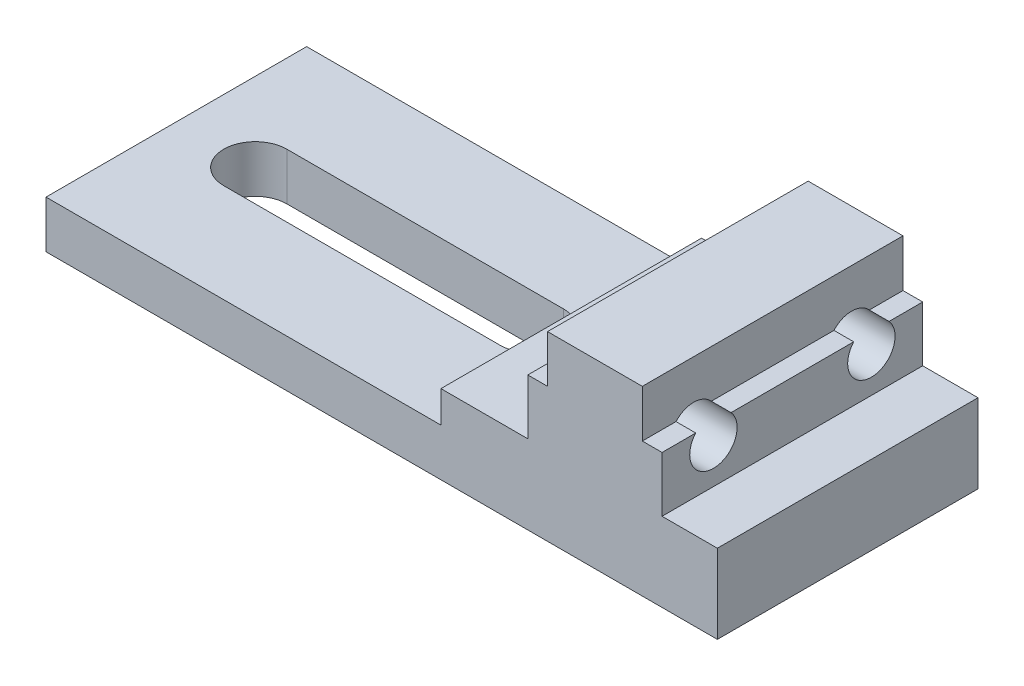
ISO-10303-21;
HEADER;
FILE_DESCRIPTION(('STEP AP214'),'2;1');
FILE_NAME('part.step','',(''),(''),'','','');
FILE_SCHEMA(('AUTOMOTIVE_DESIGN { 1 0 10303 214 1 1 1 1 }'));
ENDSEC;
DATA;
#1=APPLICATION_CONTEXT('core data for automotive mechanical design processes');
#2=APPLICATION_PROTOCOL_DEFINITION('international standard','automotive_design',2000,#1);
#3=PRODUCT_CONTEXT('',#1,'mechanical');
#4=PRODUCT('Part','Part','',(#3));
#5=PRODUCT_RELATED_PRODUCT_CATEGORY('part','',(#4));
#6=PRODUCT_DEFINITION_FORMATION('','',#4);
#7=PRODUCT_DEFINITION_CONTEXT('part definition',#1,'design');
#8=PRODUCT_DEFINITION('design','',#6,#7);
#9=PRODUCT_DEFINITION_SHAPE('','',#8);
#10=(LENGTH_UNIT() NAMED_UNIT(*) SI_UNIT(.MILLI.,.METRE.));
#11=(NAMED_UNIT(*) PLANE_ANGLE_UNIT() SI_UNIT($,.RADIAN.));
#12=(NAMED_UNIT(*) SI_UNIT($,.STERADIAN.) SOLID_ANGLE_UNIT());
#13=UNCERTAINTY_MEASURE_WITH_UNIT(LENGTH_MEASURE(1.E-05),#10,'distance_accuracy_value','');
#14=(GEOMETRIC_REPRESENTATION_CONTEXT(3) GLOBAL_UNCERTAINTY_ASSIGNED_CONTEXT((#13)) GLOBAL_UNIT_ASSIGNED_CONTEXT((#10,
#11,#12)) REPRESENTATION_CONTEXT('',''));
#15=CARTESIAN_POINT('',(0.,0.,0.));
#16=DIRECTION('',(0.,0.,1.));
#17=DIRECTION('',(1.,0.,0.));
#18=AXIS2_PLACEMENT_3D('',#15,#16,#17);
#19=CARTESIAN_POINT('',(78.,17.,16.5));
#20=DIRECTION('',(0.,-1.,0.));
#21=DIRECTION('',(0.,0.,-1.));
#22=AXIS2_PLACEMENT_3D('',#19,#20,#21);
#23=PLANE('',#22);
#24=DIRECTION('',(0.,0.,-1.));
#25=VECTOR('',#24,1.);
#26=CARTESIAN_POINT('',(75.5,17.,16.5));
#27=LINE('',#26,#25);
#28=CARTESIAN_POINT('',(75.5,17.,-12.2360679774997));
#29=VERTEX_POINT('',#28);
#30=CARTESIAN_POINT('',(75.5,17.,-16.5));
#31=VERTEX_POINT('',#30);
#32=EDGE_CURVE('E218',#29,#31,#27,.T.);
#33=ORIENTED_EDGE('',*,*,#32,.F.);
#34=DIRECTION('',(1.,0.,0.));
#35=VECTOR('',#34,1.);
#36=CARTESIAN_POINT('',(45.,17.,-12.2360679774997));
#37=LINE('',#36,#35);
#38=CARTESIAN_POINT('',(78.,17.,-12.2360679774997));
#39=VERTEX_POINT('',#38);
#40=EDGE_CURVE('E48',#29,#39,#37,.T.);
#41=ORIENTED_EDGE('',*,*,#40,.T.);
#42=DIRECTION('',(0.,0.,-1.));
#43=VECTOR('',#42,1.);
#44=CARTESIAN_POINT('',(78.,17.,16.5));
#45=LINE('',#44,#43);
#46=CARTESIAN_POINT('',(78.,17.,-16.5));
#47=VERTEX_POINT('',#46);
#48=EDGE_CURVE('E216',#39,#47,#45,.T.);
#49=ORIENTED_EDGE('',*,*,#48,.T.);
#50=DIRECTION('',(-1.,0.,0.));
#51=VECTOR('',#50,1.);
#52=CARTESIAN_POINT('',(78.,17.,-16.5));
#53=LINE('',#52,#51);
#54=EDGE_CURVE('E390',#47,#31,#53,.T.);
#55=ORIENTED_EDGE('',*,*,#54,.T.);
#56=EDGE_LOOP('',(#33,#41,#49,#55));
#57=FACE_BOUND('',#56,.T.);
#58=ADVANCED_FACE('F33',(#57),#23,.F.);
#59=CARTESIAN_POINT('',(63.5,17.,16.5));
#60=DIRECTION('',(0.,-1.,0.));
#61=DIRECTION('',(0.,0.,-1.));
#62=AXIS2_PLACEMENT_3D('',#59,#60,#61);
#63=PLANE('',#62);
#64=DIRECTION('',(0.,0.,-1.));
#65=VECTOR('',#64,1.);
#66=CARTESIAN_POINT('',(61.,17.,16.5));
#67=LINE('',#66,#65);
#68=CARTESIAN_POINT('',(61.,17.,-12.2360679774997));
#69=VERTEX_POINT('',#68);
#70=CARTESIAN_POINT('',(61.,17.,-16.5));
#71=VERTEX_POINT('',#70);
#72=EDGE_CURVE('E270',#69,#71,#67,.T.);
#73=ORIENTED_EDGE('',*,*,#72,.F.);
#74=DIRECTION('',(1.,0.,0.));
#75=VECTOR('',#74,1.);
#76=CARTESIAN_POINT('',(45.,17.,-12.2360679774997));
#77=LINE('',#76,#75);
#78=CARTESIAN_POINT('',(63.5,17.,-12.2360679774997));
#79=VERTEX_POINT('',#78);
#80=EDGE_CURVE('E56',#69,#79,#77,.T.);
#81=ORIENTED_EDGE('',*,*,#80,.T.);
#82=DIRECTION('',(0.,0.,-1.));
#83=VECTOR('',#82,1.);
#84=CARTESIAN_POINT('',(63.5,17.,16.5));
#85=LINE('',#84,#83);
#86=CARTESIAN_POINT('',(63.5,17.,-16.5));
#87=VERTEX_POINT('',#86);
#88=EDGE_CURVE('E272',#79,#87,#85,.T.);
#89=ORIENTED_EDGE('',*,*,#88,.T.);
#90=DIRECTION('',(-1.,0.,0.));
#91=VECTOR('',#90,1.);
#92=CARTESIAN_POINT('',(63.5,17.,-16.5));
#93=LINE('',#92,#91);
#94=EDGE_CURVE('E399',#87,#71,#93,.T.);
#95=ORIENTED_EDGE('',*,*,#94,.T.);
#96=EDGE_LOOP('',(#73,#81,#89,#95));
#97=FACE_BOUND('',#96,.T.);
#98=ADVANCED_FACE('F454',(#97),#63,.F.);
#99=CARTESIAN_POINT('',(78.,17.,7.76393202250029));
#100=VERTEX_POINT('',#99);
#101=CARTESIAN_POINT('',(78.,17.,-7.76393202250029));
#102=VERTEX_POINT('',#101);
#103=EDGE_CURVE('E226',#100,#102,#45,.T.);
#104=ORIENTED_EDGE('',*,*,#103,.T.);
#105=DIRECTION('',(1.,0.,0.));
#106=VECTOR('',#105,1.);
#107=CARTESIAN_POINT('',(45.,17.,-7.76393202250029));
#108=LINE('',#107,#106);
#109=CARTESIAN_POINT('',(75.5,17.,-7.76393202250029));
#110=VERTEX_POINT('',#109);
#111=EDGE_CURVE('E206',#102,#110,#108,.F.);
#112=ORIENTED_EDGE('',*,*,#111,.T.);
#113=CARTESIAN_POINT('',(75.5,17.,7.76393202250029));
#114=VERTEX_POINT('',#113);
#115=EDGE_CURVE('E231',#114,#110,#27,.T.);
#116=ORIENTED_EDGE('',*,*,#115,.F.);
#117=DIRECTION('',(1.,0.,0.));
#118=VECTOR('',#117,1.);
#119=CARTESIAN_POINT('',(45.,17.,7.76393202250029));
#120=LINE('',#119,#118);
#121=EDGE_CURVE('E300',#114,#100,#120,.T.);
#122=ORIENTED_EDGE('',*,*,#121,.T.);
#123=EDGE_LOOP('',(#104,#112,#116,#122));
#124=FACE_BOUND('',#123,.T.);
#125=ADVANCED_FACE('F299',(#124),#23,.F.);
#126=CARTESIAN_POINT('',(63.5,17.,7.76393202250029));
#127=VERTEX_POINT('',#126);
#128=CARTESIAN_POINT('',(63.5,17.,-7.76393202250029));
#129=VERTEX_POINT('',#128);
#130=EDGE_CURVE('E281',#127,#129,#85,.T.);
#131=ORIENTED_EDGE('',*,*,#130,.T.);
#132=DIRECTION('',(1.,0.,0.));
#133=VECTOR('',#132,1.);
#134=CARTESIAN_POINT('',(45.,17.,-7.76393202250029));
#135=LINE('',#134,#133);
#136=CARTESIAN_POINT('',(61.,17.,-7.76393202250029));
#137=VERTEX_POINT('',#136);
#138=EDGE_CURVE('E211',#129,#137,#135,.F.);
#139=ORIENTED_EDGE('',*,*,#138,.T.);
#140=CARTESIAN_POINT('',(61.,17.,7.76393202250029));
#141=VERTEX_POINT('',#140);
#142=EDGE_CURVE('E257',#141,#137,#67,.T.);
#143=ORIENTED_EDGE('',*,*,#142,.F.);
#144=DIRECTION('',(1.,0.,0.));
#145=VECTOR('',#144,1.);
#146=CARTESIAN_POINT('',(45.,17.,7.76393202250029));
#147=LINE('',#146,#145);
#148=EDGE_CURVE('E268',#141,#127,#147,.T.);
#149=ORIENTED_EDGE('',*,*,#148,.T.);
#150=EDGE_LOOP('',(#131,#139,#143,#149));
#151=FACE_BOUND('',#150,.T.);
#152=ADVANCED_FACE('F267',(#151),#63,.F.);
#153=CARTESIAN_POINT('',(0.,6.,16.5));
#154=DIRECTION('',(1.,0.,0.));
#155=DIRECTION('',(0.,1.,0.));
#156=AXIS2_PLACEMENT_3D('',#153,#154,#155);
#157=PLANE('',#156);
#158=DIRECTION('',(0.,-1.,0.));
#159=VECTOR('',#158,1.);
#160=CARTESIAN_POINT('',(0.,6.,-16.5));
#161=LINE('',#160,#159);
#162=CARTESIAN_POINT('',(0.,6.,-16.5));
#163=VERTEX_POINT('',#162);
#164=CARTESIAN_POINT('',(0.,0.,-16.5));
#165=VERTEX_POINT('',#164);
#166=EDGE_CURVE('E343',#163,#165,#161,.T.);
#167=ORIENTED_EDGE('',*,*,#166,.T.);
#168=DIRECTION('',(0.,0.,-1.));
#169=VECTOR('',#168,1.);
#170=CARTESIAN_POINT('',(0.,0.,16.5));
#171=LINE('',#170,#169);
#172=CARTESIAN_POINT('',(0.,0.,16.5));
#173=VERTEX_POINT('',#172);
#174=EDGE_CURVE('E249',#173,#165,#171,.T.);
#175=ORIENTED_EDGE('',*,*,#174,.F.);
#176=DIRECTION('',(0.,-1.,0.));
#177=VECTOR('',#176,1.);
#178=CARTESIAN_POINT('',(0.,6.,16.5));
#179=LINE('',#178,#177);
#180=CARTESIAN_POINT('',(0.,6.,16.5));
#181=VERTEX_POINT('',#180);
#182=EDGE_CURVE('E350',#181,#173,#179,.T.);
#183=ORIENTED_EDGE('',*,*,#182,.F.);
#184=DIRECTION('',(0.,0.,-1.));
#185=VECTOR('',#184,1.);
#186=CARTESIAN_POINT('',(0.,6.,16.5));
#187=LINE('',#186,#185);
#188=EDGE_CURVE('E380',#181,#163,#187,.T.);
#189=ORIENTED_EDGE('',*,*,#188,.T.);
#190=EDGE_LOOP('',(#167,#175,#183,#189));
#191=FACE_BOUND('',#190,.T.);
#192=ADVANCED_FACE('F35',(#191),#157,.F.);
#193=CARTESIAN_POINT('',(0.,0.,16.5));
#194=DIRECTION('',(0.,1.,0.));
#195=DIRECTION('',(0.,0.,1.));
#196=AXIS2_PLACEMENT_3D('',#193,#194,#195);
#197=PLANE('',#196);
#198=DIRECTION('',(-1.,0.,0.));
#199=VECTOR('',#198,1.);
#200=CARTESIAN_POINT('',(10.,0.,-4.));
#201=LINE('',#200,#199);
#202=CARTESIAN_POINT('',(45.,0.,-4.));
#203=VERTEX_POINT('',#202);
#204=CARTESIAN_POINT('',(10.,0.,-4.));
#205=VERTEX_POINT('',#204);
#206=EDGE_CURVE('E328',#203,#205,#201,.T.);
#207=ORIENTED_EDGE('',*,*,#206,.T.);
#208=CARTESIAN_POINT('',(10.,0.,0.));
#209=DIRECTION('',(0.,1.,0.));
#210=DIRECTION('',(-1.,0.,0.));
#211=AXIS2_PLACEMENT_3D('',#208,#209,#210);
#212=CIRCLE('',#211,4.);
#213=CARTESIAN_POINT('',(10.,0.,4.));
#214=VERTEX_POINT('',#213);
#215=EDGE_CURVE('E318',#205,#214,#212,.T.);
#216=ORIENTED_EDGE('',*,*,#215,.T.);
#217=DIRECTION('',(1.,0.,0.));
#218=VECTOR('',#217,1.);
#219=CARTESIAN_POINT('',(10.,0.,4.));
#220=LINE('',#219,#218);
#221=CARTESIAN_POINT('',(45.,0.,4.));
#222=VERTEX_POINT('',#221);
#223=EDGE_CURVE('E321',#214,#222,#220,.T.);
#224=ORIENTED_EDGE('',*,*,#223,.T.);
#225=CARTESIAN_POINT('',(45.,0.,0.));
#226=DIRECTION('',(0.,1.,0.));
#227=DIRECTION('',(-1.,0.,0.));
#228=AXIS2_PLACEMENT_3D('',#225,#226,#227);
#229=CIRCLE('',#228,4.);
#230=EDGE_CURVE('E325',#222,#203,#229,.T.);
#231=ORIENTED_EDGE('',*,*,#230,.T.);
#232=EDGE_LOOP('',(#207,#216,#224,#231));
#233=FACE_BOUND('',#232,.T.);
#234=DIRECTION('',(1.,0.,0.));
#235=VECTOR('',#234,1.);
#236=CARTESIAN_POINT('',(0.,0.,-16.5));
#237=LINE('',#236,#235);
#238=CARTESIAN_POINT('',(85.,0.,-16.5));
#239=VERTEX_POINT('',#238);
#240=EDGE_CURVE('E383',#165,#239,#237,.T.);
#241=ORIENTED_EDGE('',*,*,#240,.T.);
#242=DIRECTION('',(0.,0.,-1.));
#243=VECTOR('',#242,1.);
#244=CARTESIAN_POINT('',(85.,0.,16.5));
#245=LINE('',#244,#243);
#246=CARTESIAN_POINT('',(85.,0.,16.5));
#247=VERTEX_POINT('',#246);
#248=EDGE_CURVE('E244',#247,#239,#245,.T.);
#249=ORIENTED_EDGE('',*,*,#248,.F.);
#250=DIRECTION('',(1.,0.,0.));
#251=VECTOR('',#250,1.);
#252=CARTESIAN_POINT('',(0.,0.,16.5));
#253=LINE('',#252,#251);
#254=EDGE_CURVE('E353',#173,#247,#253,.T.);
#255=ORIENTED_EDGE('',*,*,#254,.F.);
#256=ORIENTED_EDGE('',*,*,#174,.T.);
#257=EDGE_LOOP('',(#241,#249,#255,#256));
#258=FACE_BOUND('',#257,.T.);
#259=ADVANCED_FACE('F474',(#233,#258),#197,.F.);
#260=CARTESIAN_POINT('',(85.,0.,16.5));
#261=DIRECTION('',(-1.,0.,0.));
#262=DIRECTION('',(0.,0.,1.));
#263=AXIS2_PLACEMENT_3D('',#260,#261,#262);
#264=PLANE('',#263);
#265=DIRECTION('',(0.,1.,0.));
#266=VECTOR('',#265,1.);
#267=CARTESIAN_POINT('',(85.,0.,-16.5));
#268=LINE('',#267,#266);
#269=CARTESIAN_POINT('',(85.,10.,-16.5));
#270=VERTEX_POINT('',#269);
#271=EDGE_CURVE('E385',#239,#270,#268,.T.);
#272=ORIENTED_EDGE('',*,*,#271,.T.);
#273=DIRECTION('',(0.,0.,-1.));
#274=VECTOR('',#273,1.);
#275=CARTESIAN_POINT('',(85.,10.,16.5));
#276=LINE('',#275,#274);
#277=CARTESIAN_POINT('',(85.,10.,16.5));
#278=VERTEX_POINT('',#277);
#279=EDGE_CURVE('E240',#278,#270,#276,.T.);
#280=ORIENTED_EDGE('',*,*,#279,.F.);
#281=DIRECTION('',(0.,1.,0.));
#282=VECTOR('',#281,1.);
#283=CARTESIAN_POINT('',(85.,0.,16.5));
#284=LINE('',#283,#282);
#285=EDGE_CURVE('E356',#247,#278,#284,.T.);
#286=ORIENTED_EDGE('',*,*,#285,.F.);
#287=ORIENTED_EDGE('',*,*,#248,.T.);
#288=EDGE_LOOP('',(#272,#280,#286,#287));
#289=FACE_BOUND('',#288,.T.);
#290=ADVANCED_FACE('F471',(#289),#264,.F.);
#291=CARTESIAN_POINT('',(85.,10.,16.5));
#292=DIRECTION('',(0.,-1.,0.));
#293=DIRECTION('',(0.,0.,-1.));
#294=AXIS2_PLACEMENT_3D('',#291,#292,#293);
#295=PLANE('',#294);
#296=DIRECTION('',(-1.,0.,0.));
#297=VECTOR('',#296,1.);
#298=CARTESIAN_POINT('',(85.,10.,-16.5));
#299=LINE('',#298,#297);
#300=CARTESIAN_POINT('',(78.,10.,-16.5));
#301=VERTEX_POINT('',#300);
#302=EDGE_CURVE('E387',#270,#301,#299,.T.);
#303=ORIENTED_EDGE('',*,*,#302,.T.);
#304=DIRECTION('',(0.,0.,-1.));
#305=VECTOR('',#304,1.);
#306=CARTESIAN_POINT('',(78.,10.,16.5));
#307=LINE('',#306,#305);
#308=CARTESIAN_POINT('',(78.,10.,16.5));
#309=VERTEX_POINT('',#308);
#310=EDGE_CURVE('E235',#309,#301,#307,.T.);
#311=ORIENTED_EDGE('',*,*,#310,.F.);
#312=DIRECTION('',(-1.,0.,0.));
#313=VECTOR('',#312,1.);
#314=CARTESIAN_POINT('',(85.,10.,16.5));
#315=LINE('',#314,#313);
#316=EDGE_CURVE('E358',#278,#309,#315,.T.);
#317=ORIENTED_EDGE('',*,*,#316,.F.);
#318=ORIENTED_EDGE('',*,*,#279,.T.);
#319=EDGE_LOOP('',(#303,#311,#317,#318));
#320=FACE_BOUND('',#319,.T.);
#321=ADVANCED_FACE('F467',(#320),#295,.F.);
#322=CARTESIAN_POINT('',(78.,10.,16.5));
#323=DIRECTION('',(-1.,0.,0.));
#324=DIRECTION('',(0.,0.,1.));
#325=AXIS2_PLACEMENT_3D('',#322,#323,#324);
#326=PLANE('',#325);
#327=ORIENTED_EDGE('',*,*,#48,.F.);
#328=CARTESIAN_POINT('',(78.,14.9999999999999,-10.));
#329=DIRECTION('',(1.,0.,0.));
#330=DIRECTION('',(0.,0.,-1.));
#331=AXIS2_PLACEMENT_3D('',#328,#329,#330);
#332=CIRCLE('',#331,3.);
#333=EDGE_CURVE('E203',#102,#39,#332,.T.);
#334=ORIENTED_EDGE('',*,*,#333,.F.);
#335=ORIENTED_EDGE('',*,*,#103,.F.);
#336=CARTESIAN_POINT('',(78.,14.9999999999999,10.));
#337=DIRECTION('',(1.,0.,0.));
#338=DIRECTION('',(0.,0.,-1.));
#339=AXIS2_PLACEMENT_3D('',#336,#337,#338);
#340=CIRCLE('',#339,3.);
#341=CARTESIAN_POINT('',(78.,17.,12.2360679774997));
#342=VERTEX_POINT('',#341);
#343=EDGE_CURVE('E219',#342,#100,#340,.T.);
#344=ORIENTED_EDGE('',*,*,#343,.F.);
#345=CARTESIAN_POINT('',(78.,17.,16.5));
#346=VERTEX_POINT('',#345);
#347=EDGE_CURVE('E229',#346,#342,#45,.T.);
#348=ORIENTED_EDGE('',*,*,#347,.F.);
#349=DIRECTION('',(0.,1.,0.));
#350=VECTOR('',#349,1.);
#351=CARTESIAN_POINT('',(78.,10.,16.5));
#352=LINE('',#351,#350);
#353=EDGE_CURVE('E360',#309,#346,#352,.T.);
#354=ORIENTED_EDGE('',*,*,#353,.F.);
#355=ORIENTED_EDGE('',*,*,#310,.T.);
#356=DIRECTION('',(0.,1.,0.));
#357=VECTOR('',#356,1.);
#358=CARTESIAN_POINT('',(78.,10.,-16.5));
#359=LINE('',#358,#357);
#360=EDGE_CURVE('E224',#301,#47,#359,.T.);
#361=ORIENTED_EDGE('',*,*,#360,.T.);
#362=EDGE_LOOP('',(#327,#334,#335,#344,#348,#354,#355,#361));
#363=FACE_BOUND('',#362,.T.);
#364=ADVANCED_FACE('F221',(#363),#326,.F.);
#365=ORIENTED_EDGE('',*,*,#347,.T.);
#366=DIRECTION('',(1.,0.,0.));
#367=VECTOR('',#366,1.);
#368=CARTESIAN_POINT('',(45.,17.,12.2360679774997));
#369=LINE('',#368,#367);
#370=CARTESIAN_POINT('',(75.5,17.,12.2360679774997));
#371=VERTEX_POINT('',#370);
#372=EDGE_CURVE('E314',#342,#371,#369,.F.);
#373=ORIENTED_EDGE('',*,*,#372,.T.);
#374=CARTESIAN_POINT('',(75.5,17.,16.5));
#375=VERTEX_POINT('',#374);
#376=EDGE_CURVE('E227',#375,#371,#27,.T.);
#377=ORIENTED_EDGE('',*,*,#376,.F.);
#378=DIRECTION('',(-1.,0.,0.));
#379=VECTOR('',#378,1.);
#380=CARTESIAN_POINT('',(78.,17.,16.5));
#381=LINE('',#380,#379);
#382=EDGE_CURVE('E362',#346,#375,#381,.T.);
#383=ORIENTED_EDGE('',*,*,#382,.F.);
#384=EDGE_LOOP('',(#365,#373,#377,#383));
#385=FACE_BOUND('',#384,.T.);
#386=ADVANCED_FACE('F461',(#385),#23,.F.);
#387=CARTESIAN_POINT('',(75.5,17.,16.5));
#388=DIRECTION('',(-1.,0.,0.));
#389=DIRECTION('',(0.,0.,1.));
#390=AXIS2_PLACEMENT_3D('',#387,#388,#389);
#391=PLANE('',#390);
#392=ORIENTED_EDGE('',*,*,#115,.T.);
#393=CARTESIAN_POINT('',(75.5,14.9999999999999,-10.));
#394=DIRECTION('',(-1.,0.,0.));
#395=DIRECTION('',(0.,0.,1.));
#396=AXIS2_PLACEMENT_3D('',#393,#394,#395);
#397=CIRCLE('',#396,3.);
#398=EDGE_CURVE('E295',#110,#29,#397,.T.);
#399=ORIENTED_EDGE('',*,*,#398,.T.);
#400=ORIENTED_EDGE('',*,*,#32,.T.);
#401=DIRECTION('',(0.,1.,0.));
#402=VECTOR('',#401,1.);
#403=CARTESIAN_POINT('',(75.5,17.,-16.5));
#404=LINE('',#403,#402);
#405=CARTESIAN_POINT('',(75.5,23.,-16.5));
#406=VERTEX_POINT('',#405);
#407=EDGE_CURVE('E392',#31,#406,#404,.T.);
#408=ORIENTED_EDGE('',*,*,#407,.T.);
#409=DIRECTION('',(0.,0.,-1.));
#410=VECTOR('',#409,1.);
#411=CARTESIAN_POINT('',(75.5,23.,16.5));
#412=LINE('',#411,#410);
#413=CARTESIAN_POINT('',(75.5,23.,16.5));
#414=VERTEX_POINT('',#413);
#415=EDGE_CURVE('E284',#414,#406,#412,.T.);
#416=ORIENTED_EDGE('',*,*,#415,.F.);
#417=DIRECTION('',(0.,1.,0.));
#418=VECTOR('',#417,1.);
#419=CARTESIAN_POINT('',(75.5,17.,16.5));
#420=LINE('',#419,#418);
#421=EDGE_CURVE('E364',#375,#414,#420,.T.);
#422=ORIENTED_EDGE('',*,*,#421,.F.);
#423=ORIENTED_EDGE('',*,*,#376,.T.);
#424=CARTESIAN_POINT('',(75.5,14.9999999999999,10.));
#425=DIRECTION('',(-1.,0.,0.));
#426=DIRECTION('',(0.,0.,1.));
#427=AXIS2_PLACEMENT_3D('',#424,#425,#426);
#428=CIRCLE('',#427,3.);
#429=EDGE_CURVE('E296',#371,#114,#428,.T.);
#430=ORIENTED_EDGE('',*,*,#429,.T.);
#431=EDGE_LOOP('',(#392,#399,#400,#408,#416,#422,#423,#430));
#432=FACE_BOUND('',#431,.T.);
#433=ADVANCED_FACE('F294',(#432),#391,.F.);
#434=CARTESIAN_POINT('',(75.5,23.,16.5));
#435=DIRECTION('',(0.,-1.,0.));
#436=DIRECTION('',(1.,0.,0.));
#437=AXIS2_PLACEMENT_3D('',#434,#435,#436);
#438=PLANE('',#437);
#439=DIRECTION('',(-1.,0.,0.));
#440=VECTOR('',#439,1.);
#441=CARTESIAN_POINT('',(75.5,23.,-16.5));
#442=LINE('',#441,#440);
#443=CARTESIAN_POINT('',(63.5,23.,-16.5));
#444=VERTEX_POINT('',#443);
#445=EDGE_CURVE('E394',#406,#444,#442,.T.);
#446=ORIENTED_EDGE('',*,*,#445,.T.);
#447=DIRECTION('',(0.,0.,-1.));
#448=VECTOR('',#447,1.);
#449=CARTESIAN_POINT('',(63.5,23.,16.5));
#450=LINE('',#449,#448);
#451=CARTESIAN_POINT('',(63.5,23.,16.5));
#452=VERTEX_POINT('',#451);
#453=EDGE_CURVE('E280',#452,#444,#450,.T.);
#454=ORIENTED_EDGE('',*,*,#453,.F.);
#455=DIRECTION('',(-1.,0.,0.));
#456=VECTOR('',#455,1.);
#457=CARTESIAN_POINT('',(75.5,23.,16.5));
#458=LINE('',#457,#456);
#459=EDGE_CURVE('E366',#414,#452,#458,.T.);
#460=ORIENTED_EDGE('',*,*,#459,.F.);
#461=ORIENTED_EDGE('',*,*,#415,.T.);
#462=EDGE_LOOP('',(#446,#454,#460,#461));
#463=FACE_BOUND('',#462,.T.);
#464=ADVANCED_FACE('F458',(#463),#438,.F.);
#465=CARTESIAN_POINT('',(63.5,23.,16.5));
#466=DIRECTION('',(1.,0.,0.));
#467=DIRECTION('',(0.,0.,-1.));
#468=AXIS2_PLACEMENT_3D('',#465,#466,#467);
#469=PLANE('',#468);
#470=ORIENTED_EDGE('',*,*,#88,.F.);
#471=CARTESIAN_POINT('',(63.5,14.9999999999999,-10.));
#472=DIRECTION('',(1.,0.,0.));
#473=DIRECTION('',(0.,0.,-1.));
#474=AXIS2_PLACEMENT_3D('',#471,#472,#473);
#475=CIRCLE('',#474,3.);
#476=EDGE_CURVE('E302',#79,#129,#475,.T.);
#477=ORIENTED_EDGE('',*,*,#476,.T.);
#478=ORIENTED_EDGE('',*,*,#130,.F.);
#479=CARTESIAN_POINT('',(63.5,14.9999999999999,10.));
#480=DIRECTION('',(1.,0.,0.));
#481=DIRECTION('',(0.,0.,-1.));
#482=AXIS2_PLACEMENT_3D('',#479,#480,#481);
#483=CIRCLE('',#482,3.);
#484=CARTESIAN_POINT('',(63.5,17.,12.2360679774997));
#485=VERTEX_POINT('',#484);
#486=EDGE_CURVE('E310',#127,#485,#483,.T.);
#487=ORIENTED_EDGE('',*,*,#486,.T.);
#488=CARTESIAN_POINT('',(63.5,17.,16.5));
#489=VERTEX_POINT('',#488);
#490=EDGE_CURVE('E277',#489,#485,#85,.T.);
#491=ORIENTED_EDGE('',*,*,#490,.F.);
#492=DIRECTION('',(0.,-1.,0.));
#493=VECTOR('',#492,1.);
#494=CARTESIAN_POINT('',(63.5,23.,16.5));
#495=LINE('',#494,#493);
#496=EDGE_CURVE('E368',#452,#489,#495,.T.);
#497=ORIENTED_EDGE('',*,*,#496,.F.);
#498=ORIENTED_EDGE('',*,*,#453,.T.);
#499=DIRECTION('',(0.,-1.,0.));
#500=VECTOR('',#499,1.);
#501=CARTESIAN_POINT('',(63.5,23.,-16.5));
#502=LINE('',#501,#500);
#503=EDGE_CURVE('E396',#444,#87,#502,.T.);
#504=ORIENTED_EDGE('',*,*,#503,.T.);
#505=EDGE_LOOP('',(#470,#477,#478,#487,#491,#497,#498,#504));
#506=FACE_BOUND('',#505,.T.);
#507=ADVANCED_FACE('F450',(#506),#469,.F.);
#508=ORIENTED_EDGE('',*,*,#490,.T.);
#509=DIRECTION('',(1.,0.,0.));
#510=VECTOR('',#509,1.);
#511=CARTESIAN_POINT('',(45.,17.,12.2360679774997));
#512=LINE('',#511,#510);
#513=CARTESIAN_POINT('',(61.,17.,12.2360679774997));
#514=VERTEX_POINT('',#513);
#515=EDGE_CURVE('E307',#485,#514,#512,.F.);
#516=ORIENTED_EDGE('',*,*,#515,.T.);
#517=CARTESIAN_POINT('',(61.,17.,16.5));
#518=VERTEX_POINT('',#517);
#519=EDGE_CURVE('E260',#518,#514,#67,.T.);
#520=ORIENTED_EDGE('',*,*,#519,.F.);
#521=DIRECTION('',(-1.,0.,0.));
#522=VECTOR('',#521,1.);
#523=CARTESIAN_POINT('',(63.5,17.,16.5));
#524=LINE('',#523,#522);
#525=EDGE_CURVE('E370',#489,#518,#524,.T.);
#526=ORIENTED_EDGE('',*,*,#525,.F.);
#527=EDGE_LOOP('',(#508,#516,#520,#526));
#528=FACE_BOUND('',#527,.T.);
#529=ADVANCED_FACE('F445',(#528),#63,.F.);
#530=CARTESIAN_POINT('',(61.,17.,16.5));
#531=DIRECTION('',(1.,0.,0.));
#532=DIRECTION('',(0.,0.,-1.));
#533=AXIS2_PLACEMENT_3D('',#530,#531,#532);
#534=PLANE('',#533);
#535=ORIENTED_EDGE('',*,*,#142,.T.);
#536=CARTESIAN_POINT('',(61.,14.9999999999999,-10.));
#537=DIRECTION('',(1.,0.,0.));
#538=DIRECTION('',(0.,0.,-1.));
#539=AXIS2_PLACEMENT_3D('',#536,#537,#538);
#540=CIRCLE('',#539,3.);
#541=EDGE_CURVE('E11',#137,#69,#540,.T.);
#542=ORIENTED_EDGE('',*,*,#541,.T.);
#543=ORIENTED_EDGE('',*,*,#72,.T.);
#544=DIRECTION('',(0.,-1.,0.));
#545=VECTOR('',#544,1.);
#546=CARTESIAN_POINT('',(61.,17.,-16.5));
#547=LINE('',#546,#545);
#548=CARTESIAN_POINT('',(61.,10.,-16.5));
#549=VERTEX_POINT('',#548);
#550=EDGE_CURVE('E402',#71,#549,#547,.T.);
#551=ORIENTED_EDGE('',*,*,#550,.T.);
#552=DIRECTION('',(0.,0.,-1.));
#553=VECTOR('',#552,1.);
#554=CARTESIAN_POINT('',(61.,10.,16.5));
#555=LINE('',#554,#553);
#556=CARTESIAN_POINT('',(61.,10.,16.5));
#557=VERTEX_POINT('',#556);
#558=EDGE_CURVE('E273',#557,#549,#555,.T.);
#559=ORIENTED_EDGE('',*,*,#558,.F.);
#560=DIRECTION('',(0.,-1.,0.));
#561=VECTOR('',#560,1.);
#562=CARTESIAN_POINT('',(61.,17.,16.5));
#563=LINE('',#562,#561);
#564=EDGE_CURVE('E372',#518,#557,#563,.T.);
#565=ORIENTED_EDGE('',*,*,#564,.F.);
#566=ORIENTED_EDGE('',*,*,#519,.T.);
#567=CARTESIAN_POINT('',(61.,14.9999999999999,10.));
#568=DIRECTION('',(1.,0.,0.));
#569=DIRECTION('',(0.,0.,-1.));
#570=AXIS2_PLACEMENT_3D('',#567,#568,#569);
#571=CIRCLE('',#570,3.);
#572=EDGE_CURVE('E41',#514,#141,#571,.T.);
#573=ORIENTED_EDGE('',*,*,#572,.T.);
#574=EDGE_LOOP('',(#535,#542,#543,#551,#559,#565,#566,#573));
#575=FACE_BOUND('',#574,.T.);
#576=ADVANCED_FACE('F256',(#575),#534,.F.);
#577=CARTESIAN_POINT('',(50.,10.,16.5));
#578=DIRECTION('',(0.,-1.,0.));
#579=DIRECTION('',(0.,0.,-1.));
#580=AXIS2_PLACEMENT_3D('',#577,#578,#579);
#581=PLANE('',#580);
#582=DIRECTION('',(-1.,0.,0.));
#583=VECTOR('',#582,1.);
#584=CARTESIAN_POINT('',(50.,10.,-16.5));
#585=LINE('',#584,#583);
#586=CARTESIAN_POINT('',(50.,10.,-16.5));
#587=VERTEX_POINT('',#586);
#588=EDGE_CURVE('E404',#549,#587,#585,.T.);
#589=ORIENTED_EDGE('',*,*,#588,.T.);
#590=DIRECTION('',(0.,0.,-1.));
#591=VECTOR('',#590,1.);
#592=CARTESIAN_POINT('',(50.,10.,16.5));
#593=LINE('',#592,#591);
#594=CARTESIAN_POINT('',(50.,10.,16.5));
#595=VERTEX_POINT('',#594);
#596=EDGE_CURVE('E413',#595,#587,#593,.T.);
#597=ORIENTED_EDGE('',*,*,#596,.F.);
#598=DIRECTION('',(-1.,0.,0.));
#599=VECTOR('',#598,1.);
#600=CARTESIAN_POINT('',(50.,10.,16.5));
#601=LINE('',#600,#599);
#602=EDGE_CURVE('E374',#557,#595,#601,.T.);
#603=ORIENTED_EDGE('',*,*,#602,.F.);
#604=ORIENTED_EDGE('',*,*,#558,.T.);
#605=EDGE_LOOP('',(#589,#597,#603,#604));
#606=FACE_BOUND('',#605,.T.);
#607=ADVANCED_FACE('F424',(#606),#581,.F.);
#608=CARTESIAN_POINT('',(50.,6.00000000000001,16.5));
#609=DIRECTION('',(1.,0.,0.));
#610=DIRECTION('',(0.,0.,-1.));
#611=AXIS2_PLACEMENT_3D('',#608,#609,#610);
#612=PLANE('',#611);
#613=DIRECTION('',(0.,-1.,0.));
#614=VECTOR('',#613,1.);
#615=CARTESIAN_POINT('',(50.,6.00000000000001,-16.5));
#616=LINE('',#615,#614);
#617=CARTESIAN_POINT('',(50.,6.00000000000001,-16.5));
#618=VERTEX_POINT('',#617);
#619=EDGE_CURVE('E406',#587,#618,#616,.T.);
#620=ORIENTED_EDGE('',*,*,#619,.T.);
#621=DIRECTION('',(0.,0.,-1.));
#622=VECTOR('',#621,1.);
#623=CARTESIAN_POINT('',(50.,6.00000000000001,16.5));
#624=LINE('',#623,#622);
#625=CARTESIAN_POINT('',(50.,6.00000000000001,16.5));
#626=VERTEX_POINT('',#625);
#627=EDGE_CURVE('E411',#626,#618,#624,.T.);
#628=ORIENTED_EDGE('',*,*,#627,.F.);
#629=DIRECTION('',(0.,-1.,0.));
#630=VECTOR('',#629,1.);
#631=CARTESIAN_POINT('',(50.,6.00000000000001,16.5));
#632=LINE('',#631,#630);
#633=EDGE_CURVE('E376',#595,#626,#632,.T.);
#634=ORIENTED_EDGE('',*,*,#633,.F.);
#635=ORIENTED_EDGE('',*,*,#596,.T.);
#636=EDGE_LOOP('',(#620,#628,#634,#635));
#637=FACE_BOUND('',#636,.T.);
#638=ADVANCED_FACE('F432',(#637),#612,.F.);
#639=CARTESIAN_POINT('',(50.,6.00000000000001,16.5));
#640=DIRECTION('',(0.,-1.,0.));
#641=DIRECTION('',(1.,0.,0.));
#642=AXIS2_PLACEMENT_3D('',#639,#640,#641);
#643=PLANE('',#642);
#644=DIRECTION('',(1.,0.,0.));
#645=VECTOR('',#644,1.);
#646=CARTESIAN_POINT('',(10.,6.,4.));
#647=LINE('',#646,#645);
#648=CARTESIAN_POINT('',(10.,6.,4.));
#649=VERTEX_POINT('',#648);
#650=CARTESIAN_POINT('',(45.,6.00000000000001,4.));
#651=VERTEX_POINT('',#650);
#652=EDGE_CURVE('E333',#649,#651,#647,.T.);
#653=ORIENTED_EDGE('',*,*,#652,.F.);
#654=CARTESIAN_POINT('',(10.,6.,0.));
#655=DIRECTION('',(0.,1.,0.));
#656=DIRECTION('',(-1.,0.,0.));
#657=AXIS2_PLACEMENT_3D('',#654,#655,#656);
#658=CIRCLE('',#657,4.);
#659=CARTESIAN_POINT('',(10.,6.,-4.));
#660=VERTEX_POINT('',#659);
#661=EDGE_CURVE('E317',#660,#649,#658,.T.);
#662=ORIENTED_EDGE('',*,*,#661,.F.);
#663=DIRECTION('',(-1.,0.,0.));
#664=VECTOR('',#663,1.);
#665=CARTESIAN_POINT('',(10.,6.,-4.));
#666=LINE('',#665,#664);
#667=CARTESIAN_POINT('',(45.,6.00000000000001,-4.));
#668=VERTEX_POINT('',#667);
#669=EDGE_CURVE('E322',#668,#660,#666,.T.);
#670=ORIENTED_EDGE('',*,*,#669,.F.);
#671=CARTESIAN_POINT('',(45.,6.00000000000001,0.));
#672=DIRECTION('',(0.,1.,0.));
#673=DIRECTION('',(-1.,0.,0.));
#674=AXIS2_PLACEMENT_3D('',#671,#672,#673);
#675=CIRCLE('',#674,4.);
#676=EDGE_CURVE('E336',#651,#668,#675,.T.);
#677=ORIENTED_EDGE('',*,*,#676,.F.);
#678=EDGE_LOOP('',(#653,#662,#670,#677));
#679=FACE_BOUND('',#678,.T.);
#680=DIRECTION('',(-1.,0.,0.));
#681=VECTOR('',#680,1.);
#682=CARTESIAN_POINT('',(50.,6.00000000000001,-16.5));
#683=LINE('',#682,#681);
#684=EDGE_CURVE('E354',#618,#163,#683,.T.);
#685=ORIENTED_EDGE('',*,*,#684,.T.);
#686=ORIENTED_EDGE('',*,*,#188,.F.);
#687=DIRECTION('',(-1.,0.,0.));
#688=VECTOR('',#687,1.);
#689=CARTESIAN_POINT('',(50.,6.00000000000001,16.5));
#690=LINE('',#689,#688);
#691=EDGE_CURVE('E378',#626,#181,#690,.T.);
#692=ORIENTED_EDGE('',*,*,#691,.F.);
#693=ORIENTED_EDGE('',*,*,#627,.T.);
#694=EDGE_LOOP('',(#685,#686,#692,#693));
#695=FACE_BOUND('',#694,.T.);
#696=ADVANCED_FACE('F435',(#679,#695),#643,.F.);
#697=CARTESIAN_POINT('',(0.,0.,16.5));
#698=DIRECTION('',(0.,0.,1.));
#699=DIRECTION('',(1.,0.,0.));
#700=AXIS2_PLACEMENT_3D('',#697,#698,#699);
#701=PLANE('',#700);
#702=ORIENTED_EDGE('',*,*,#182,.T.);
#703=ORIENTED_EDGE('',*,*,#254,.T.);
#704=ORIENTED_EDGE('',*,*,#285,.T.);
#705=ORIENTED_EDGE('',*,*,#316,.T.);
#706=ORIENTED_EDGE('',*,*,#353,.T.);
#707=ORIENTED_EDGE('',*,*,#382,.T.);
#708=ORIENTED_EDGE('',*,*,#421,.T.);
#709=ORIENTED_EDGE('',*,*,#459,.T.);
#710=ORIENTED_EDGE('',*,*,#496,.T.);
#711=ORIENTED_EDGE('',*,*,#525,.T.);
#712=ORIENTED_EDGE('',*,*,#564,.T.);
#713=ORIENTED_EDGE('',*,*,#602,.T.);
#714=ORIENTED_EDGE('',*,*,#633,.T.);
#715=ORIENTED_EDGE('',*,*,#691,.T.);
#716=EDGE_LOOP('',(#702,#703,#704,#705,#706,#707,#708,#709,#710,#711,#712,#713,#714,#715));
#717=FACE_BOUND('',#716,.T.);
#718=ADVANCED_FACE('F439',(#717),#701,.T.);
#719=CARTESIAN_POINT('',(0.,0.,-16.5));
#720=DIRECTION('',(0.,0.,1.));
#721=DIRECTION('',(1.,0.,0.));
#722=AXIS2_PLACEMENT_3D('',#719,#720,#721);
#723=PLANE('',#722);
#724=ORIENTED_EDGE('',*,*,#166,.F.);
#725=ORIENTED_EDGE('',*,*,#684,.F.);
#726=ORIENTED_EDGE('',*,*,#619,.F.);
#727=ORIENTED_EDGE('',*,*,#588,.F.);
#728=ORIENTED_EDGE('',*,*,#550,.F.);
#729=ORIENTED_EDGE('',*,*,#94,.F.);
#730=ORIENTED_EDGE('',*,*,#503,.F.);
#731=ORIENTED_EDGE('',*,*,#445,.F.);
#732=ORIENTED_EDGE('',*,*,#407,.F.);
#733=ORIENTED_EDGE('',*,*,#54,.F.);
#734=ORIENTED_EDGE('',*,*,#360,.F.);
#735=ORIENTED_EDGE('',*,*,#302,.F.);
#736=ORIENTED_EDGE('',*,*,#271,.F.);
#737=ORIENTED_EDGE('',*,*,#240,.F.);
#738=EDGE_LOOP('',(#724,#725,#726,#727,#728,#729,#730,#731,#732,#733,#734,#735,#736,#737));
#739=FACE_BOUND('',#738,.T.);
#740=ADVANCED_FACE('F428',(#739),#723,.F.);
#741=CARTESIAN_POINT('',(10.,0.,0.));
#742=DIRECTION('',(0.,1.,0.));
#743=DIRECTION('',(-1.,0.,0.));
#744=AXIS2_PLACEMENT_3D('',#741,#742,#743);
#745=CYLINDRICAL_SURFACE('',#744,4.);
#746=ORIENTED_EDGE('',*,*,#661,.T.);
#747=DIRECTION('',(0.,1.,0.));
#748=VECTOR('',#747,1.);
#749=CARTESIAN_POINT('',(10.,0.,4.));
#750=LINE('',#749,#748);
#751=EDGE_CURVE('E331',#214,#649,#750,.T.);
#752=ORIENTED_EDGE('',*,*,#751,.F.);
#753=ORIENTED_EDGE('',*,*,#215,.F.);
#754=DIRECTION('',(0.,1.,0.));
#755=VECTOR('',#754,1.);
#756=CARTESIAN_POINT('',(10.,0.,-4.));
#757=LINE('',#756,#755);
#758=EDGE_CURVE('E341',#205,#660,#757,.T.);
#759=ORIENTED_EDGE('',*,*,#758,.T.);
#760=EDGE_LOOP('',(#746,#752,#753,#759));
#761=FACE_BOUND('',#760,.T.);
#762=ADVANCED_FACE('F558',(#761),#745,.F.);
#763=CARTESIAN_POINT('',(10.,0.,-4.));
#764=DIRECTION('',(0.,0.,-1.));
#765=DIRECTION('',(-1.,0.,0.));
#766=AXIS2_PLACEMENT_3D('',#763,#764,#765);
#767=PLANE('',#766);
#768=ORIENTED_EDGE('',*,*,#669,.T.);
#769=ORIENTED_EDGE('',*,*,#758,.F.);
#770=ORIENTED_EDGE('',*,*,#206,.F.);
#771=DIRECTION('',(0.,1.,0.));
#772=VECTOR('',#771,1.);
#773=CARTESIAN_POINT('',(45.,0.,-4.));
#774=LINE('',#773,#772);
#775=EDGE_CURVE('E344',#203,#668,#774,.T.);
#776=ORIENTED_EDGE('',*,*,#775,.T.);
#777=EDGE_LOOP('',(#768,#769,#770,#776));
#778=FACE_BOUND('',#777,.T.);
#779=ADVANCED_FACE('F580',(#778),#767,.F.);
#780=CARTESIAN_POINT('',(45.,0.,0.));
#781=DIRECTION('',(0.,1.,0.));
#782=DIRECTION('',(-1.,0.,0.));
#783=AXIS2_PLACEMENT_3D('',#780,#781,#782);
#784=CYLINDRICAL_SURFACE('',#783,4.);
#785=ORIENTED_EDGE('',*,*,#676,.T.);
#786=ORIENTED_EDGE('',*,*,#775,.F.);
#787=ORIENTED_EDGE('',*,*,#230,.F.);
#788=DIRECTION('',(0.,1.,0.));
#789=VECTOR('',#788,1.);
#790=CARTESIAN_POINT('',(45.,0.,4.));
#791=LINE('',#790,#789);
#792=EDGE_CURVE('E346',#222,#651,#791,.T.);
#793=ORIENTED_EDGE('',*,*,#792,.T.);
#794=EDGE_LOOP('',(#785,#786,#787,#793));
#795=FACE_BOUND('',#794,.T.);
#796=ADVANCED_FACE('F590',(#795),#784,.F.);
#797=CARTESIAN_POINT('',(10.,0.,4.));
#798=DIRECTION('',(0.,0.,1.));
#799=DIRECTION('',(1.,0.,0.));
#800=AXIS2_PLACEMENT_3D('',#797,#798,#799);
#801=PLANE('',#800);
#802=ORIENTED_EDGE('',*,*,#652,.T.);
#803=ORIENTED_EDGE('',*,*,#792,.F.);
#804=ORIENTED_EDGE('',*,*,#223,.F.);
#805=ORIENTED_EDGE('',*,*,#751,.T.);
#806=EDGE_LOOP('',(#802,#803,#804,#805));
#807=FACE_BOUND('',#806,.T.);
#808=ADVANCED_FACE('F600',(#807),#801,.F.);
#809=CARTESIAN_POINT('',(45.,14.9999999999999,10.));
#810=DIRECTION('',(1.,0.,0.));
#811=DIRECTION('',(0.,0.,-1.));
#812=AXIS2_PLACEMENT_3D('',#809,#810,#811);
#813=CYLINDRICAL_SURFACE('',#812,3.);
#814=ORIENTED_EDGE('',*,*,#148,.F.);
#815=ORIENTED_EDGE('',*,*,#572,.F.);
#816=ORIENTED_EDGE('',*,*,#515,.F.);
#817=ORIENTED_EDGE('',*,*,#486,.F.);
#818=EDGE_LOOP('',(#814,#815,#816,#817));
#819=FACE_BOUND('',#818,.T.);
#820=ORIENTED_EDGE('',*,*,#429,.F.);
#821=ORIENTED_EDGE('',*,*,#372,.F.);
#822=ORIENTED_EDGE('',*,*,#343,.T.);
#823=ORIENTED_EDGE('',*,*,#121,.F.);
#824=EDGE_LOOP('',(#820,#821,#822,#823));
#825=FACE_BOUND('',#824,.T.);
#826=ADVANCED_FACE('F446',(#819,#825),#813,.F.);
#827=CARTESIAN_POINT('',(45.,14.9999999999999,-10.));
#828=DIRECTION('',(1.,0.,0.));
#829=DIRECTION('',(0.,0.,-1.));
#830=AXIS2_PLACEMENT_3D('',#827,#828,#829);
#831=CYLINDRICAL_SURFACE('',#830,3.);
#832=ORIENTED_EDGE('',*,*,#80,.F.);
#833=ORIENTED_EDGE('',*,*,#541,.F.);
#834=ORIENTED_EDGE('',*,*,#138,.F.);
#835=ORIENTED_EDGE('',*,*,#476,.F.);
#836=EDGE_LOOP('',(#832,#833,#834,#835));
#837=FACE_BOUND('',#836,.T.);
#838=ORIENTED_EDGE('',*,*,#398,.F.);
#839=ORIENTED_EDGE('',*,*,#111,.F.);
#840=ORIENTED_EDGE('',*,*,#333,.T.);
#841=ORIENTED_EDGE('',*,*,#40,.F.);
#842=EDGE_LOOP('',(#838,#839,#840,#841));
#843=FACE_BOUND('',#842,.T.);
#844=ADVANCED_FACE('F204',(#837,#843),#831,.F.);
#845=CLOSED_SHELL('',(#58,#98,#125,#152,#192,#259,#290,#321,#364,#386,#433,#464,#507,#529,#576,
#607,#638,#696,#718,#740,#762,#779,#796,#808,#826,#844));
#846=MANIFOLD_SOLID_BREP('B2',#845);
#847=ADVANCED_BREP_SHAPE_REPRESENTATION('',(#18,#846),#14);
#848=SHAPE_DEFINITION_REPRESENTATION(#9,#847);
ENDSEC;
END-ISO-10303-21;
